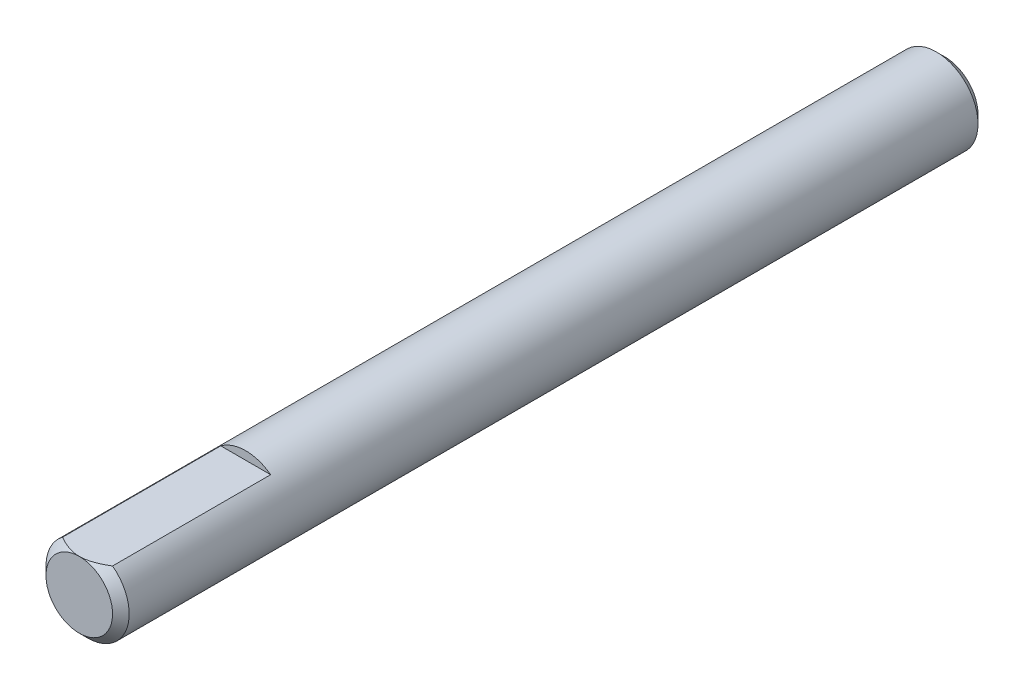
ISO-10303-21;
HEADER;
FILE_DESCRIPTION(('STEP AP214'),'2;1');
FILE_NAME('part.step','',(''),(''),'','','');
FILE_SCHEMA(('AUTOMOTIVE_DESIGN { 1 0 10303 214 1 1 1 1 }'));
ENDSEC;
DATA;
#1=APPLICATION_CONTEXT('core data for automotive mechanical design processes');
#2=APPLICATION_PROTOCOL_DEFINITION('international standard','automotive_design',2000,#1);
#3=PRODUCT_CONTEXT('',#1,'mechanical');
#4=PRODUCT('Part','Part','',(#3));
#5=PRODUCT_RELATED_PRODUCT_CATEGORY('part','',(#4));
#6=PRODUCT_DEFINITION_FORMATION('','',#4);
#7=PRODUCT_DEFINITION_CONTEXT('part definition',#1,'design');
#8=PRODUCT_DEFINITION('design','',#6,#7);
#9=PRODUCT_DEFINITION_SHAPE('','',#8);
#10=(LENGTH_UNIT() NAMED_UNIT(*) SI_UNIT(.MILLI.,.METRE.));
#11=(NAMED_UNIT(*) PLANE_ANGLE_UNIT() SI_UNIT($,.RADIAN.));
#12=(NAMED_UNIT(*) SI_UNIT($,.STERADIAN.) SOLID_ANGLE_UNIT());
#13=UNCERTAINTY_MEASURE_WITH_UNIT(LENGTH_MEASURE(1.E-05),#10,'distance_accuracy_value','');
#14=(GEOMETRIC_REPRESENTATION_CONTEXT(3) GLOBAL_UNCERTAINTY_ASSIGNED_CONTEXT((#13)) GLOBAL_UNIT_ASSIGNED_CONTEXT((#10,
#11,#12)) REPRESENTATION_CONTEXT('',''));
#15=CARTESIAN_POINT('',(0.,0.,0.));
#16=DIRECTION('',(0.,0.,1.));
#17=DIRECTION('',(1.,0.,0.));
#18=AXIS2_PLACEMENT_3D('',#15,#16,#17);
#19=CARTESIAN_POINT('',(0.,0.,52.));
#20=DIRECTION('',(0.,0.,-1.));
#21=DIRECTION('',(-1.,0.,0.));
#22=AXIS2_PLACEMENT_3D('',#19,#20,#21);
#23=CYLINDRICAL_SURFACE('',#22,2.5);
#24=CARTESIAN_POINT('',(0.,0.,0.500000000000021));
#25=DIRECTION('',(0.,0.,1.));
#26=DIRECTION('',(1.,0.,0.));
#27=AXIS2_PLACEMENT_3D('',#24,#25,#26);
#28=CIRCLE('',#27,2.5);
#29=CARTESIAN_POINT('',(2.5,0.,0.500000000000021));
#30=VERTEX_POINT('',#29);
#31=EDGE_CURVE('E89',#30,#30,#28,.T.);
#32=ORIENTED_EDGE('',*,*,#31,.T.);
#33=EDGE_LOOP('',(#32));
#34=FACE_BOUND('',#33,.T.);
#35=DIRECTION('',(0.,0.,-1.));
#36=VECTOR('',#35,1.);
#37=CARTESIAN_POINT('',(1.5,2.,52.));
#38=LINE('',#37,#36);
#39=CARTESIAN_POINT('',(1.5,2.,42.));
#40=VERTEX_POINT('',#39);
#41=CARTESIAN_POINT('',(1.5,2.,51.5));
#42=VERTEX_POINT('',#41);
#43=EDGE_CURVE('E77',#40,#42,#38,.F.);
#44=ORIENTED_EDGE('',*,*,#43,.T.);
#45=CARTESIAN_POINT('',(0.,0.,51.5));
#46=DIRECTION('',(0.,0.,1.));
#47=DIRECTION('',(1.,0.,0.));
#48=AXIS2_PLACEMENT_3D('',#45,#46,#47);
#49=CIRCLE('',#48,2.5);
#50=CARTESIAN_POINT('',(-1.5,2.,51.5));
#51=VERTEX_POINT('',#50);
#52=EDGE_CURVE('E74',#42,#51,#49,.F.);
#53=ORIENTED_EDGE('',*,*,#52,.T.);
#54=DIRECTION('',(0.,0.,-1.));
#55=VECTOR('',#54,1.);
#56=CARTESIAN_POINT('',(-1.5,2.,52.));
#57=LINE('',#56,#55);
#58=CARTESIAN_POINT('',(-1.5,2.,42.));
#59=VERTEX_POINT('',#58);
#60=EDGE_CURVE('E71',#51,#59,#57,.T.);
#61=ORIENTED_EDGE('',*,*,#60,.T.);
#62=CARTESIAN_POINT('',(0.,0.,42.));
#63=DIRECTION('',(0.,0.,1.));
#64=DIRECTION('',(1.,0.,0.));
#65=AXIS2_PLACEMENT_3D('',#62,#63,#64);
#66=CIRCLE('',#65,2.5);
#67=EDGE_CURVE('E73',#40,#59,#66,.T.);
#68=ORIENTED_EDGE('',*,*,#67,.F.);
#69=EDGE_LOOP('',(#44,#53,#61,#68));
#70=FACE_BOUND('',#69,.T.);
#71=ADVANCED_FACE('F35',(#34,#70),#23,.T.);
#72=CARTESIAN_POINT('',(0.,0.,52.));
#73=DIRECTION('',(0.,0.,1.));
#74=DIRECTION('',(1.,0.,0.));
#75=AXIS2_PLACEMENT_3D('',#72,#73,#74);
#76=PLANE('',#75);
#77=CARTESIAN_POINT('',(0.,0.,52.));
#78=DIRECTION('',(0.,0.,1.));
#79=DIRECTION('',(1.,0.,0.));
#80=AXIS2_PLACEMENT_3D('',#77,#78,#79);
#81=CIRCLE('',#80,2.00000000000003);
#82=CARTESIAN_POINT('',(0.,2.,52.));
#83=VERTEX_POINT('',#82);
#84=EDGE_CURVE('E95',#83,#83,#81,.T.);
#85=ORIENTED_EDGE('',*,*,#84,.T.);
#86=EDGE_LOOP('',(#85));
#87=FACE_BOUND('',#86,.T.);
#88=ADVANCED_FACE('F106',(#87),#76,.T.);
#89=CARTESIAN_POINT('',(0.,0.,0.));
#90=DIRECTION('',(0.,0.,1.));
#91=DIRECTION('',(1.,0.,0.));
#92=AXIS2_PLACEMENT_3D('',#89,#90,#91);
#93=PLANE('',#92);
#94=CARTESIAN_POINT('',(0.,0.,0.));
#95=DIRECTION('',(0.,0.,1.));
#96=DIRECTION('',(1.,0.,0.));
#97=AXIS2_PLACEMENT_3D('',#94,#95,#96);
#98=CIRCLE('',#97,1.99999999999998);
#99=CARTESIAN_POINT('',(1.99999999999998,0.,0.));
#100=VERTEX_POINT('',#99);
#101=EDGE_CURVE('E92',#100,#100,#98,.F.);
#102=ORIENTED_EDGE('',*,*,#101,.T.);
#103=EDGE_LOOP('',(#102));
#104=FACE_BOUND('',#103,.T.);
#105=ADVANCED_FACE('F110',(#104),#93,.F.);
#106=CARTESIAN_POINT('',(0.,0.,42.));
#107=DIRECTION('',(0.,0.,1.));
#108=DIRECTION('',(1.,0.,0.));
#109=AXIS2_PLACEMENT_3D('',#106,#107,#108);
#110=PLANE('',#109);
#111=ORIENTED_EDGE('',*,*,#67,.T.);
#112=DIRECTION('',(1.,0.,0.));
#113=VECTOR('',#112,1.);
#114=CARTESIAN_POINT('',(-3.76287917342341,2.,42.));
#115=LINE('',#114,#113);
#116=EDGE_CURVE('E82',#59,#40,#115,.T.);
#117=ORIENTED_EDGE('',*,*,#116,.T.);
#118=EDGE_LOOP('',(#111,#117));
#119=FACE_BOUND('',#118,.T.);
#120=ADVANCED_FACE('F81',(#119),#110,.T.);
#121=CARTESIAN_POINT('',(-3.76287917342341,2.,42.));
#122=DIRECTION('',(0.,-1.,0.));
#123=DIRECTION('',(0.,0.,-1.));
#124=AXIS2_PLACEMENT_3D('',#121,#122,#123);
#125=PLANE('',#124);
#126=CARTESIAN_POINT('',(-1.5,2.,51.5));
#127=CARTESIAN_POINT('',(-1.42763018659213,2.,51.5433736980276));
#128=CARTESIAN_POINT('',(-1.35436226532258,2.,51.5853687019536));
#129=CARTESIAN_POINT('',(-1.20549660628809,2.,51.6656443583189));
#130=CARTESIAN_POINT('',(-1.12989157710705,2.,51.7039114197062));
#131=CARTESIAN_POINT('',(-0.978296734874831,2.,51.774534191742));
#132=CARTESIAN_POINT('',(-0.902366736266408,2.,51.8070165390548));
#133=CARTESIAN_POINT('',(-0.748220644904075,2.,51.865809016699));
#134=CARTESIAN_POINT('',(-0.670007876047704,2.,51.8921276624894));
#135=CARTESIAN_POINT('',(-0.543060600019244,2.,51.9280861032667));
#136=CARTESIAN_POINT('',(-0.495021163503643,2.,51.9401901027996));
#137=CARTESIAN_POINT('',(-0.398260419217585,2.,51.9612794306282));
#138=CARTESIAN_POINT('',(-0.349539198139858,2.,51.9702651517484));
#139=CARTESIAN_POINT('',(-0.250852177401963,2.,51.9849271240241));
#140=CARTESIAN_POINT('',(-0.200878654038635,2.,51.9905520018212));
#141=CARTESIAN_POINT('',(-0.100607619276177,2.,51.9981023484678));
#142=CARTESIAN_POINT('',(-0.0503098472705327,2.,52.0000243314446));
#143=CARTESIAN_POINT('',(0.,2.,52.));
#144=B_SPLINE_CURVE_WITH_KNOTS('',3,(#126,#127,#128,#129,#130,#131,#132,#133,#134,#135,#136,
#137,#138,#139,#140,#141,#142,#143),.UNSPECIFIED.,.F.,.F.,(4,2,2,2,2,2,2,2,4),(0.,
0.253195034695594,0.507281075974285,0.754837752612876,1.00205037282501,1.15058504578388,
1.29910100031797,1.44983263801685,1.60070610394699),.UNSPECIFIED.);
#145=EDGE_CURVE('E50',#51,#83,#144,.T.);
#146=ORIENTED_EDGE('',*,*,#145,.T.);
#147=CARTESIAN_POINT('',(0.,2.00000000000003,52.));
#148=CARTESIAN_POINT('',(0.0614966481035626,2.00000000000001,52.0000514930088));
#149=CARTESIAN_POINT('',(0.12296179611878,2.,51.997164788165));
#150=CARTESIAN_POINT('',(0.245274670057058,2.,51.9859212389057));
#151=CARTESIAN_POINT('',(0.306123362775477,2.,51.9775750221521));
#152=CARTESIAN_POINT('',(0.425885509906889,2.,51.9559969816614));
#153=CARTESIAN_POINT('',(0.484814317272305,2.,51.9428488248966));
#154=CARTESIAN_POINT('',(0.601555526074529,2.,51.9122507618696));
#155=CARTESIAN_POINT('',(0.659367456410748,2.,51.8947990813251));
#156=CARTESIAN_POINT('',(0.784576263433305,2.,51.8525702057821));
#157=CARTESIAN_POINT('',(0.851714510760646,2.,51.8270315815753));
#158=CARTESIAN_POINT('',(0.984250024576901,2.,51.7717452055525));
#159=CARTESIAN_POINT('',(1.04964642506794,2.,51.7419954048129));
#160=CARTESIAN_POINT('',(1.18016546542205,2.,51.6784785026746));
#161=CARTESIAN_POINT('',(1.24525271545218,2.,51.6446394298057));
#162=CARTESIAN_POINT('',(1.37378197006118,2.,51.5742160914668));
#163=CARTESIAN_POINT('',(1.43722666174301,2.,51.5376367483736));
#164=CARTESIAN_POINT('',(1.5,2.,51.5));
#165=B_SPLINE_CURVE_WITH_KNOTS('',3,(#147,#148,#149,#150,#151,#152,#153,#154,#155,#156,#157,
#158,#159,#160,#161,#162,#163,#164),.UNSPECIFIED.,.F.,.F.,(4,2,2,2,2,2,2,2,4),(0.,
0.184371949240824,0.368386057907034,0.549336051664288,0.730360773654878,0.945674044871382,
1.16109243790834,1.38109142427278,1.60070428639641),.UNSPECIFIED.);
#166=EDGE_CURVE('E11',#83,#42,#165,.T.);
#167=ORIENTED_EDGE('',*,*,#166,.T.);
#168=ORIENTED_EDGE('',*,*,#43,.F.);
#169=ORIENTED_EDGE('',*,*,#116,.F.);
#170=ORIENTED_EDGE('',*,*,#60,.F.);
#171=EDGE_LOOP('',(#146,#167,#168,#169,#170));
#172=FACE_BOUND('',#171,.T.);
#173=ADVANCED_FACE('F84',(#172),#125,.F.);
#174=CARTESIAN_POINT('',(0.,0.,0.500000000000021));
#175=DIRECTION('',(0.,0.,1.));
#176=DIRECTION('',(1.,0.,0.));
#177=AXIS2_PLACEMENT_3D('',#174,#175,#176);
#178=CONICAL_SURFACE('',#177,2.5,0.785398163397447);
#179=ORIENTED_EDGE('',*,*,#101,.F.);
#180=EDGE_LOOP('',(#179));
#181=FACE_BOUND('',#180,.T.);
#182=ORIENTED_EDGE('',*,*,#31,.F.);
#183=EDGE_LOOP('',(#182));
#184=FACE_BOUND('',#183,.T.);
#185=ADVANCED_FACE('F105',(#181,#184),#178,.T.);
#186=CARTESIAN_POINT('',(0.,0.,52.));
#187=DIRECTION('',(0.,0.,-1.));
#188=DIRECTION('',(-1.,0.,0.));
#189=AXIS2_PLACEMENT_3D('',#186,#187,#188);
#190=CONICAL_SURFACE('',#189,2.00000000000003,0.78539816339744);
#191=ORIENTED_EDGE('',*,*,#145,.F.);
#192=ORIENTED_EDGE('',*,*,#52,.F.);
#193=ORIENTED_EDGE('',*,*,#166,.F.);
#194=ORIENTED_EDGE('',*,*,#84,.F.);
#195=EDGE_LOOP('',(#191,#192,#193,#194));
#196=FACE_BOUND('',#195,.T.);
#197=ADVANCED_FACE('F38',(#196),#190,.T.);
#198=CLOSED_SHELL('',(#71,#88,#105,#120,#173,#185,#197));
#199=MANIFOLD_SOLID_BREP('B2',#198);
#200=ADVANCED_BREP_SHAPE_REPRESENTATION('',(#18,#199),#14);
#201=SHAPE_DEFINITION_REPRESENTATION(#9,#200);
ENDSEC;
END-ISO-10303-21;
